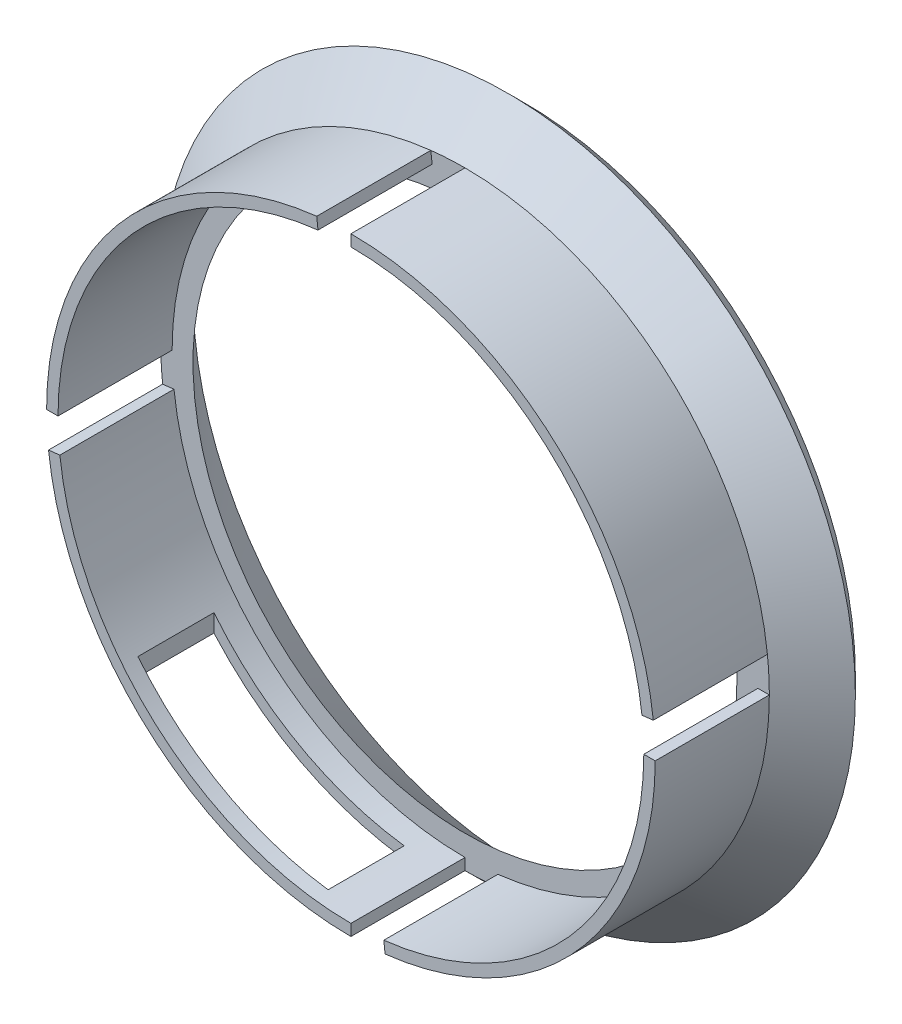
ISO-10303-21;
HEADER;
FILE_DESCRIPTION(('STEP AP214'),'2;1');
FILE_NAME('part.step','',(''),(''),'','','');
FILE_SCHEMA(('AUTOMOTIVE_DESIGN { 1 0 10303 214 1 1 1 1 }'));
ENDSEC;
DATA;
#1=APPLICATION_CONTEXT('core data for automotive mechanical design processes');
#2=APPLICATION_PROTOCOL_DEFINITION('international standard','automotive_design',2000,#1);
#3=PRODUCT_CONTEXT('',#1,'mechanical');
#4=PRODUCT('Part','Part','',(#3));
#5=PRODUCT_RELATED_PRODUCT_CATEGORY('part','',(#4));
#6=PRODUCT_DEFINITION_FORMATION('','',#4);
#7=PRODUCT_DEFINITION_CONTEXT('part definition',#1,'design');
#8=PRODUCT_DEFINITION('design','',#6,#7);
#9=PRODUCT_DEFINITION_SHAPE('','',#8);
#10=(LENGTH_UNIT() NAMED_UNIT(*) SI_UNIT(.MILLI.,.METRE.));
#11=(NAMED_UNIT(*) PLANE_ANGLE_UNIT() SI_UNIT($,.RADIAN.));
#12=(NAMED_UNIT(*) SI_UNIT($,.STERADIAN.) SOLID_ANGLE_UNIT());
#13=UNCERTAINTY_MEASURE_WITH_UNIT(LENGTH_MEASURE(1.E-05),#10,'distance_accuracy_value','');
#14=(GEOMETRIC_REPRESENTATION_CONTEXT(3) GLOBAL_UNCERTAINTY_ASSIGNED_CONTEXT((#13)) GLOBAL_UNIT_ASSIGNED_CONTEXT((#10,
#11,#12)) REPRESENTATION_CONTEXT('',''));
#15=CARTESIAN_POINT('',(0.,0.,0.));
#16=DIRECTION('',(0.,0.,1.));
#17=DIRECTION('',(1.,0.,0.));
#18=AXIS2_PLACEMENT_3D('',#15,#16,#17);
#19=CARTESIAN_POINT('',(0.,0.,15.));
#20=DIRECTION('',(0.,0.,-1.));
#21=DIRECTION('',(-1.,0.,0.));
#22=AXIS2_PLACEMENT_3D('',#19,#20,#21);
#23=CYLINDRICAL_SURFACE('',#22,38.5);
#24=CARTESIAN_POINT('',(0.,0.,0.));
#25=DIRECTION('',(0.,0.,1.));
#26=DIRECTION('',(1.,0.,0.));
#27=AXIS2_PLACEMENT_3D('',#24,#25,#26);
#28=CIRCLE('',#27,38.5);
#29=CARTESIAN_POINT('',(-4.32439239838076,38.2563671875,0.));
#30=VERTEX_POINT('',#29);
#31=CARTESIAN_POINT('',(-38.5,0.,0.));
#32=VERTEX_POINT('',#31);
#33=EDGE_CURVE('E331',#30,#32,#28,.T.);
#34=ORIENTED_EDGE('',*,*,#33,.F.);
#35=DIRECTION('',(0.,0.,-1.));
#36=VECTOR('',#35,1.);
#37=CARTESIAN_POINT('',(-4.32439239838076,38.2563671875,15.));
#38=LINE('',#37,#36);
#39=CARTESIAN_POINT('',(-4.32439239838076,38.2563671875,15.));
#40=VERTEX_POINT('',#39);
#41=EDGE_CURVE('E11',#40,#30,#38,.T.);
#42=ORIENTED_EDGE('',*,*,#41,.F.);
#43=CARTESIAN_POINT('',(0.,0.,15.));
#44=DIRECTION('',(0.,0.,1.));
#45=DIRECTION('',(1.,0.,0.));
#46=AXIS2_PLACEMENT_3D('',#43,#44,#45);
#47=CIRCLE('',#46,38.5);
#48=CARTESIAN_POINT('',(-38.5,0.,15.));
#49=VERTEX_POINT('',#48);
#50=EDGE_CURVE('E334',#40,#49,#47,.T.);
#51=ORIENTED_EDGE('',*,*,#50,.T.);
#52=DIRECTION('',(0.,0.,-1.));
#53=VECTOR('',#52,1.);
#54=CARTESIAN_POINT('',(-38.5,0.,15.));
#55=LINE('',#54,#53);
#56=EDGE_CURVE('E346',#49,#32,#55,.T.);
#57=ORIENTED_EDGE('',*,*,#56,.T.);
#58=EDGE_LOOP('',(#34,#42,#51,#57));
#59=FACE_BOUND('',#58,.T.);
#60=ADVANCED_FACE('F47',(#59),#23,.F.);
#61=CARTESIAN_POINT('',(0.,0.,15.));
#62=DIRECTION('',(0.993671875,0.112321880477423,0.));
#63=DIRECTION('',(-0.112321880477423,0.993671875,0.));
#64=AXIS2_PLACEMENT_3D('',#61,#62,#63);
#65=PLANE('',#64);
#66=DIRECTION('',(0.112321880477423,-0.993671875,0.));
#67=VECTOR('',#66,1.);
#68=CARTESIAN_POINT('',(0.,0.,0.));
#69=LINE('',#68,#67);
#70=CARTESIAN_POINT('',(-4.4928752190969,39.746875,0.));
#71=VERTEX_POINT('',#70);
#72=EDGE_CURVE('E349',#71,#30,#69,.T.);
#73=ORIENTED_EDGE('',*,*,#72,.F.);
#74=DIRECTION('',(0.,0.,-1.));
#75=VECTOR('',#74,1.);
#76=CARTESIAN_POINT('',(-4.4928752190969,39.746875,15.));
#77=LINE('',#76,#75);
#78=CARTESIAN_POINT('',(-4.4928752190969,39.746875,15.));
#79=VERTEX_POINT('',#78);
#80=EDGE_CURVE('E54',#79,#71,#77,.T.);
#81=ORIENTED_EDGE('',*,*,#80,.F.);
#82=DIRECTION('',(0.112321880477423,-0.993671875,0.));
#83=VECTOR('',#82,1.);
#84=CARTESIAN_POINT('',(0.,0.,15.));
#85=LINE('',#84,#83);
#86=EDGE_CURVE('E337',#79,#40,#85,.T.);
#87=ORIENTED_EDGE('',*,*,#86,.T.);
#88=ORIENTED_EDGE('',*,*,#41,.T.);
#89=EDGE_LOOP('',(#73,#81,#87,#88));
#90=FACE_BOUND('',#89,.T.);
#91=ADVANCED_FACE('F368',(#90),#65,.T.);
#92=CARTESIAN_POINT('',(0.,0.,15.));
#93=DIRECTION('',(0.,0.,-1.));
#94=DIRECTION('',(-1.,0.,0.));
#95=AXIS2_PLACEMENT_3D('',#92,#93,#94);
#96=CYLINDRICAL_SURFACE('',#95,40.);
#97=CARTESIAN_POINT('',(0.,0.,0.));
#98=DIRECTION('',(0.,0.,1.));
#99=DIRECTION('',(1.,0.,0.));
#100=AXIS2_PLACEMENT_3D('',#97,#98,#99);
#101=CIRCLE('',#100,40.);
#102=CARTESIAN_POINT('',(-40.,0.,0.));
#103=VERTEX_POINT('',#102);
#104=EDGE_CURVE('E352',#71,#103,#101,.T.);
#105=ORIENTED_EDGE('',*,*,#104,.T.);
#106=DIRECTION('',(0.,0.,-1.));
#107=VECTOR('',#106,1.);
#108=CARTESIAN_POINT('',(-40.,0.,15.));
#109=LINE('',#108,#107);
#110=CARTESIAN_POINT('',(-40.,0.,15.));
#111=VERTEX_POINT('',#110);
#112=EDGE_CURVE('E358',#111,#103,#109,.T.);
#113=ORIENTED_EDGE('',*,*,#112,.F.);
#114=CARTESIAN_POINT('',(0.,0.,15.));
#115=DIRECTION('',(0.,0.,1.));
#116=DIRECTION('',(1.,0.,0.));
#117=AXIS2_PLACEMENT_3D('',#114,#115,#116);
#118=CIRCLE('',#117,40.);
#119=EDGE_CURVE('E341',#79,#111,#118,.T.);
#120=ORIENTED_EDGE('',*,*,#119,.F.);
#121=ORIENTED_EDGE('',*,*,#80,.T.);
#122=EDGE_LOOP('',(#105,#113,#120,#121));
#123=FACE_BOUND('',#122,.T.);
#124=ADVANCED_FACE('F363',(#123),#96,.T.);
#125=CARTESIAN_POINT('',(0.,0.,15.));
#126=DIRECTION('',(0.,-1.,0.));
#127=DIRECTION('',(0.,0.,-1.));
#128=AXIS2_PLACEMENT_3D('',#125,#126,#127);
#129=PLANE('',#128);
#130=DIRECTION('',(-1.,0.,0.));
#131=VECTOR('',#130,1.);
#132=CARTESIAN_POINT('',(0.,0.,0.));
#133=LINE('',#132,#131);
#134=EDGE_CURVE('E338',#32,#103,#133,.T.);
#135=ORIENTED_EDGE('',*,*,#134,.F.);
#136=ORIENTED_EDGE('',*,*,#56,.F.);
#137=DIRECTION('',(-1.,0.,0.));
#138=VECTOR('',#137,1.);
#139=CARTESIAN_POINT('',(0.,0.,15.));
#140=LINE('',#139,#138);
#141=EDGE_CURVE('E343',#49,#111,#140,.T.);
#142=ORIENTED_EDGE('',*,*,#141,.T.);
#143=ORIENTED_EDGE('',*,*,#112,.T.);
#144=EDGE_LOOP('',(#135,#136,#142,#143));
#145=FACE_BOUND('',#144,.T.);
#146=ADVANCED_FACE('F416',(#145),#129,.T.);
#147=CARTESIAN_POINT('',(0.,0.,15.));
#148=DIRECTION('',(0.,0.,1.));
#149=DIRECTION('',(1.,0.,0.));
#150=AXIS2_PLACEMENT_3D('',#147,#148,#149);
#151=PLANE('',#150);
#152=ORIENTED_EDGE('',*,*,#50,.F.);
#153=ORIENTED_EDGE('',*,*,#86,.F.);
#154=ORIENTED_EDGE('',*,*,#119,.T.);
#155=ORIENTED_EDGE('',*,*,#141,.F.);
#156=EDGE_LOOP('',(#152,#153,#154,#155));
#157=FACE_BOUND('',#156,.T.);
#158=ADVANCED_FACE('F418',(#157),#151,.T.);
#159=CARTESIAN_POINT('',(-35.7573593128807,0.,0.));
#160=DIRECTION('',(0.,0.,-1.));
#161=DIRECTION('',(-1.,0.,0.));
#162=AXIS2_PLACEMENT_3D('',#159,#160,#161);
#163=PLANE('',#162);
#164=CARTESIAN_POINT('',(0.,0.,0.));
#165=DIRECTION('',(0.,0.,1.));
#166=DIRECTION('',(1.,0.,0.));
#167=AXIS2_PLACEMENT_3D('',#164,#165,#166);
#168=CIRCLE('',#167,35.7573593128807);
#169=CARTESIAN_POINT('',(35.7573593128807,0.,0.));
#170=VERTEX_POINT('',#169);
#171=EDGE_CURVE('E318',#170,#170,#168,.T.);
#172=ORIENTED_EDGE('',*,*,#171,.F.);
#173=EDGE_LOOP('',(#172));
#174=FACE_BOUND('',#173,.T.);
#175=CARTESIAN_POINT('',(0.,0.,0.));
#176=DIRECTION('',(0.,0.,1.));
#177=DIRECTION('',(1.,0.,0.));
#178=AXIS2_PLACEMENT_3D('',#175,#176,#177);
#179=CIRCLE('',#178,40.);
#180=CARTESIAN_POINT('',(0.,-40.,0.));
#181=VERTEX_POINT('',#180);
#182=CARTESIAN_POINT('',(4.4928752190969,-39.746875,0.));
#183=VERTEX_POINT('',#182);
#184=EDGE_CURVE('E332',#181,#183,#179,.T.);
#185=ORIENTED_EDGE('',*,*,#184,.T.);
#186=DIRECTION('',(-0.112321880477423,0.993671875,0.));
#187=VECTOR('',#186,1.);
#188=CARTESIAN_POINT('',(0.,0.,0.));
#189=LINE('',#188,#187);
#190=CARTESIAN_POINT('',(4.32439239838076,-38.2563671875,0.));
#191=VERTEX_POINT('',#190);
#192=EDGE_CURVE('E236',#183,#191,#189,.T.);
#193=ORIENTED_EDGE('',*,*,#192,.T.);
#194=CARTESIAN_POINT('',(0.,0.,0.));
#195=DIRECTION('',(0.,0.,1.));
#196=DIRECTION('',(1.,0.,0.));
#197=AXIS2_PLACEMENT_3D('',#194,#195,#196);
#198=CIRCLE('',#197,38.5);
#199=CARTESIAN_POINT('',(38.5,0.,0.));
#200=VERTEX_POINT('',#199);
#201=EDGE_CURVE('E221',#191,#200,#198,.T.);
#202=ORIENTED_EDGE('',*,*,#201,.T.);
#203=DIRECTION('',(1.,0.,0.));
#204=VECTOR('',#203,1.);
#205=CARTESIAN_POINT('',(0.,0.,0.));
#206=LINE('',#205,#204);
#207=CARTESIAN_POINT('',(40.,0.,0.));
#208=VERTEX_POINT('',#207);
#209=EDGE_CURVE('E226',#200,#208,#206,.T.);
#210=ORIENTED_EDGE('',*,*,#209,.T.);
#211=CARTESIAN_POINT('',(39.746875,4.4928752190969,0.));
#212=VERTEX_POINT('',#211);
#213=EDGE_CURVE('E333',#208,#212,#179,.T.);
#214=ORIENTED_EDGE('',*,*,#213,.T.);
#215=DIRECTION('',(-0.993671875,-0.112321880477422,0.));
#216=VECTOR('',#215,1.);
#217=CARTESIAN_POINT('',(0.,0.,0.));
#218=LINE('',#217,#216);
#219=CARTESIAN_POINT('',(38.2563671875,4.32439239838076,0.));
#220=VERTEX_POINT('',#219);
#221=EDGE_CURVE('E268',#212,#220,#218,.T.);
#222=ORIENTED_EDGE('',*,*,#221,.T.);
#223=CARTESIAN_POINT('',(0.,0.,0.));
#224=DIRECTION('',(0.,0.,1.));
#225=DIRECTION('',(1.,0.,0.));
#226=AXIS2_PLACEMENT_3D('',#223,#224,#225);
#227=CIRCLE('',#226,38.5);
#228=CARTESIAN_POINT('',(0.,38.5,0.));
#229=VERTEX_POINT('',#228);
#230=EDGE_CURVE('E254',#220,#229,#227,.T.);
#231=ORIENTED_EDGE('',*,*,#230,.T.);
#232=DIRECTION('',(0.,-1.,0.));
#233=VECTOR('',#232,1.);
#234=CARTESIAN_POINT('',(0.,0.,0.));
#235=LINE('',#234,#233);
#236=CARTESIAN_POINT('',(0.,40.,0.));
#237=VERTEX_POINT('',#236);
#238=EDGE_CURVE('E259',#237,#229,#235,.T.);
#239=ORIENTED_EDGE('',*,*,#238,.F.);
#240=EDGE_CURVE('E327',#237,#71,#179,.T.);
#241=ORIENTED_EDGE('',*,*,#240,.T.);
#242=ORIENTED_EDGE('',*,*,#72,.T.);
#243=ORIENTED_EDGE('',*,*,#33,.T.);
#244=ORIENTED_EDGE('',*,*,#134,.T.);
#245=CARTESIAN_POINT('',(-39.746875,-4.4928752190969,0.));
#246=VERTEX_POINT('',#245);
#247=EDGE_CURVE('E328',#103,#246,#179,.T.);
#248=ORIENTED_EDGE('',*,*,#247,.T.);
#249=DIRECTION('',(0.993671875,0.112321880477422,0.));
#250=VECTOR('',#249,1.);
#251=CARTESIAN_POINT('',(0.,0.,0.));
#252=LINE('',#251,#250);
#253=CARTESIAN_POINT('',(-38.2563671875,-4.32439239838076,0.));
#254=VERTEX_POINT('',#253);
#255=EDGE_CURVE('E300',#246,#254,#252,.T.);
#256=ORIENTED_EDGE('',*,*,#255,.T.);
#257=CARTESIAN_POINT('',(0.,0.,0.));
#258=DIRECTION('',(0.,0.,1.));
#259=DIRECTION('',(1.,0.,0.));
#260=AXIS2_PLACEMENT_3D('',#257,#258,#259);
#261=CIRCLE('',#260,38.5);
#262=CARTESIAN_POINT('',(0.,-38.5,0.));
#263=VERTEX_POINT('',#262);
#264=EDGE_CURVE('E286',#254,#263,#261,.T.);
#265=ORIENTED_EDGE('',*,*,#264,.T.);
#266=DIRECTION('',(0.,1.,0.));
#267=VECTOR('',#266,1.);
#268=CARTESIAN_POINT('',(0.,0.,0.));
#269=LINE('',#268,#267);
#270=EDGE_CURVE('E291',#181,#263,#269,.T.);
#271=ORIENTED_EDGE('',*,*,#270,.F.);
#272=EDGE_LOOP('',(#185,#193,#202,#210,#214,#222,#231,#239,#241,#242,#243,#244,#248,#256,#265,#271));
#273=FACE_BOUND('',#272,.T.);
#274=ADVANCED_FACE('F377',(#174,#273),#163,.F.);
#275=CARTESIAN_POINT('',(0.,0.,-5.65685424949239));
#276=DIRECTION('',(0.,0.,-1.));
#277=DIRECTION('',(-1.,0.,0.));
#278=AXIS2_PLACEMENT_3D('',#275,#276,#277);
#279=CONICAL_SURFACE('',#278,45.6568542494924,0.785398163397446);
#280=ORIENTED_EDGE('',*,*,#104,.F.);
#281=ORIENTED_EDGE('',*,*,#240,.F.);
#282=CARTESIAN_POINT('',(0.,0.,0.));
#283=DIRECTION('',(0.,0.,1.));
#284=DIRECTION('',(1.,0.,0.));
#285=AXIS2_PLACEMENT_3D('',#282,#283,#284);
#286=CIRCLE('',#285,40.);
#287=EDGE_CURVE('E270',#212,#237,#286,.T.);
#288=ORIENTED_EDGE('',*,*,#287,.F.);
#289=ORIENTED_EDGE('',*,*,#213,.F.);
#290=CARTESIAN_POINT('',(0.,0.,0.));
#291=DIRECTION('',(0.,0.,1.));
#292=DIRECTION('',(1.,0.,0.));
#293=AXIS2_PLACEMENT_3D('',#290,#291,#292);
#294=CIRCLE('',#293,40.);
#295=EDGE_CURVE('E238',#183,#208,#294,.T.);
#296=ORIENTED_EDGE('',*,*,#295,.F.);
#297=ORIENTED_EDGE('',*,*,#184,.F.);
#298=CARTESIAN_POINT('',(0.,0.,0.));
#299=DIRECTION('',(0.,0.,1.));
#300=DIRECTION('',(1.,0.,0.));
#301=AXIS2_PLACEMENT_3D('',#298,#299,#300);
#302=CIRCLE('',#301,40.);
#303=EDGE_CURVE('E302',#246,#181,#302,.T.);
#304=ORIENTED_EDGE('',*,*,#303,.F.);
#305=ORIENTED_EDGE('',*,*,#247,.F.);
#306=EDGE_LOOP('',(#280,#281,#288,#289,#296,#297,#304,#305));
#307=FACE_BOUND('',#306,.T.);
#308=CARTESIAN_POINT('',(0.,0.,-5.65685424949239));
#309=DIRECTION('',(0.,0.,1.));
#310=DIRECTION('',(1.,0.,0.));
#311=AXIS2_PLACEMENT_3D('',#308,#309,#310);
#312=CIRCLE('',#311,45.6568542494924);
#313=CARTESIAN_POINT('',(45.6568542494924,0.,-5.65685424949239));
#314=VERTEX_POINT('',#313);
#315=EDGE_CURVE('E324',#314,#314,#312,.T.);
#316=ORIENTED_EDGE('',*,*,#315,.T.);
#317=EDGE_LOOP('',(#316));
#318=FACE_BOUND('',#317,.T.);
#319=ADVANCED_FACE('F372',(#307,#318),#279,.T.);
#320=CARTESIAN_POINT('',(0.,0.,-7.77817459305203));
#321=DIRECTION('',(0.,0.,1.));
#322=DIRECTION('',(1.,0.,0.));
#323=AXIS2_PLACEMENT_3D('',#320,#321,#322);
#324=CONICAL_SURFACE('',#323,43.5355339059327,0.785398163397447);
#325=ORIENTED_EDGE('',*,*,#315,.F.);
#326=EDGE_LOOP('',(#325));
#327=FACE_BOUND('',#326,.T.);
#328=CARTESIAN_POINT('',(0.,0.,-7.77817459305203));
#329=DIRECTION('',(0.,0.,1.));
#330=DIRECTION('',(1.,0.,0.));
#331=AXIS2_PLACEMENT_3D('',#328,#329,#330);
#332=CIRCLE('',#331,43.5355339059327);
#333=CARTESIAN_POINT('',(43.5355339059327,0.,-7.77817459305203));
#334=VERTEX_POINT('',#333);
#335=EDGE_CURVE('E321',#334,#334,#332,.T.);
#336=ORIENTED_EDGE('',*,*,#335,.T.);
#337=EDGE_LOOP('',(#336));
#338=FACE_BOUND('',#337,.T.);
#339=ADVANCED_FACE('F452',(#327,#338),#324,.T.);
#340=CARTESIAN_POINT('',(0.,0.,0.));
#341=DIRECTION('',(0.,0.,-1.));
#342=DIRECTION('',(-1.,0.,0.));
#343=AXIS2_PLACEMENT_3D('',#340,#341,#342);
#344=CONICAL_SURFACE('',#343,35.7573593128807,0.785398163397447);
#345=ORIENTED_EDGE('',*,*,#335,.F.);
#346=EDGE_LOOP('',(#345));
#347=FACE_BOUND('',#346,.T.);
#348=ORIENTED_EDGE('',*,*,#171,.T.);
#349=EDGE_LOOP('',(#348));
#350=FACE_BOUND('',#349,.T.);
#351=ADVANCED_FACE('F459',(#347,#350),#344,.F.);
#352=CARTESIAN_POINT('',(0.,0.,15.));
#353=DIRECTION('',(0.,0.,-1.));
#354=DIRECTION('',(-1.,0.,0.));
#355=AXIS2_PLACEMENT_3D('',#352,#353,#354);
#356=CYLINDRICAL_SURFACE('',#355,38.5);
#357=DIRECTION('',(0.,0.,-1.));
#358=VECTOR('',#357,1.);
#359=CARTESIAN_POINT('',(-30.,-24.1298570240273,15.));
#360=LINE('',#359,#358);
#361=CARTESIAN_POINT('',(-30.,-24.1298570240273,13.));
#362=VERTEX_POINT('',#361);
#363=CARTESIAN_POINT('',(-30.,-24.1298570240273,3.));
#364=VERTEX_POINT('',#363);
#365=EDGE_CURVE('E189',#362,#364,#360,.T.);
#366=ORIENTED_EDGE('',*,*,#365,.T.);
#367=CARTESIAN_POINT('',(0.,0.,3.));
#368=DIRECTION('',(0.,0.,-1.));
#369=DIRECTION('',(-1.,0.,0.));
#370=AXIS2_PLACEMENT_3D('',#367,#368,#369);
#371=CIRCLE('',#370,38.5);
#372=CARTESIAN_POINT('',(-5.,-38.1739439932528,3.));
#373=VERTEX_POINT('',#372);
#374=EDGE_CURVE('E207',#364,#373,#371,.F.);
#375=ORIENTED_EDGE('',*,*,#374,.T.);
#376=DIRECTION('',(0.,0.,-1.));
#377=VECTOR('',#376,1.);
#378=CARTESIAN_POINT('',(-5.,-38.1739439932528,15.));
#379=LINE('',#378,#377);
#380=CARTESIAN_POINT('',(-5.,-38.1739439932528,13.));
#381=VERTEX_POINT('',#380);
#382=EDGE_CURVE('E204',#373,#381,#379,.F.);
#383=ORIENTED_EDGE('',*,*,#382,.T.);
#384=CARTESIAN_POINT('',(0.,0.,13.));
#385=DIRECTION('',(0.,0.,1.));
#386=DIRECTION('',(1.,0.,0.));
#387=AXIS2_PLACEMENT_3D('',#384,#385,#386);
#388=CIRCLE('',#387,38.5);
#389=EDGE_CURVE('E197',#381,#362,#388,.F.);
#390=ORIENTED_EDGE('',*,*,#389,.T.);
#391=EDGE_LOOP('',(#366,#375,#383,#390));
#392=FACE_BOUND('',#391,.T.);
#393=ORIENTED_EDGE('',*,*,#264,.F.);
#394=DIRECTION('',(0.,0.,-1.));
#395=VECTOR('',#394,1.);
#396=CARTESIAN_POINT('',(-38.2563671875,-4.32439239838076,15.));
#397=LINE('',#396,#395);
#398=CARTESIAN_POINT('',(-38.2563671875,-4.32439239838076,15.));
#399=VERTEX_POINT('',#398);
#400=EDGE_CURVE('E315',#399,#254,#397,.T.);
#401=ORIENTED_EDGE('',*,*,#400,.F.);
#402=CARTESIAN_POINT('',(0.,0.,15.));
#403=DIRECTION('',(0.,0.,1.));
#404=DIRECTION('',(1.,0.,0.));
#405=AXIS2_PLACEMENT_3D('',#402,#403,#404);
#406=CIRCLE('',#405,38.5);
#407=CARTESIAN_POINT('',(0.,-38.5,15.));
#408=VERTEX_POINT('',#407);
#409=EDGE_CURVE('E287',#399,#408,#406,.T.);
#410=ORIENTED_EDGE('',*,*,#409,.T.);
#411=DIRECTION('',(0.,0.,-1.));
#412=VECTOR('',#411,1.);
#413=CARTESIAN_POINT('',(0.,-38.5,15.));
#414=LINE('',#413,#412);
#415=EDGE_CURVE('E298',#408,#263,#414,.T.);
#416=ORIENTED_EDGE('',*,*,#415,.T.);
#417=EDGE_LOOP('',(#393,#401,#410,#416));
#418=FACE_BOUND('',#417,.T.);
#419=ADVANCED_FACE('F388',(#392,#418),#356,.F.);
#420=CARTESIAN_POINT('',(0.,0.,15.));
#421=DIRECTION('',(-0.112321880477422,0.993671875,0.));
#422=DIRECTION('',(-0.993671875,-0.112321880477422,0.));
#423=AXIS2_PLACEMENT_3D('',#420,#421,#422);
#424=PLANE('',#423);
#425=ORIENTED_EDGE('',*,*,#255,.F.);
#426=DIRECTION('',(0.,0.,-1.));
#427=VECTOR('',#426,1.);
#428=CARTESIAN_POINT('',(-39.746875,-4.4928752190969,15.));
#429=LINE('',#428,#427);
#430=CARTESIAN_POINT('',(-39.746875,-4.4928752190969,15.));
#431=VERTEX_POINT('',#430);
#432=EDGE_CURVE('E312',#431,#246,#429,.T.);
#433=ORIENTED_EDGE('',*,*,#432,.F.);
#434=DIRECTION('',(0.993671875,0.112321880477422,0.));
#435=VECTOR('',#434,1.);
#436=CARTESIAN_POINT('',(0.,0.,15.));
#437=LINE('',#436,#435);
#438=EDGE_CURVE('E290',#431,#399,#437,.T.);
#439=ORIENTED_EDGE('',*,*,#438,.T.);
#440=ORIENTED_EDGE('',*,*,#400,.T.);
#441=EDGE_LOOP('',(#425,#433,#439,#440));
#442=FACE_BOUND('',#441,.T.);
#443=ADVANCED_FACE('F384',(#442),#424,.T.);
#444=CARTESIAN_POINT('',(0.,0.,15.));
#445=DIRECTION('',(0.,0.,-1.));
#446=DIRECTION('',(-1.,0.,0.));
#447=AXIS2_PLACEMENT_3D('',#444,#445,#446);
#448=CYLINDRICAL_SURFACE('',#447,40.);
#449=CARTESIAN_POINT('',(0.,0.,3.));
#450=DIRECTION('',(0.,0.,-1.));
#451=DIRECTION('',(-1.,0.,0.));
#452=AXIS2_PLACEMENT_3D('',#449,#450,#451);
#453=CIRCLE('',#452,40.);
#454=CARTESIAN_POINT('',(-30.,-26.4575131106459,3.));
#455=VERTEX_POINT('',#454);
#456=CARTESIAN_POINT('',(-5.,-39.6862696659689,3.));
#457=VERTEX_POINT('',#456);
#458=EDGE_CURVE('E203',#455,#457,#453,.F.);
#459=ORIENTED_EDGE('',*,*,#458,.F.);
#460=DIRECTION('',(0.,0.,-1.));
#461=VECTOR('',#460,1.);
#462=CARTESIAN_POINT('',(-30.,-26.4575131106459,15.));
#463=LINE('',#462,#461);
#464=CARTESIAN_POINT('',(-30.,-26.4575131106459,13.));
#465=VERTEX_POINT('',#464);
#466=EDGE_CURVE('E186',#465,#455,#463,.T.);
#467=ORIENTED_EDGE('',*,*,#466,.F.);
#468=CARTESIAN_POINT('',(0.,0.,13.));
#469=DIRECTION('',(0.,0.,1.));
#470=DIRECTION('',(1.,0.,0.));
#471=AXIS2_PLACEMENT_3D('',#468,#469,#470);
#472=CIRCLE('',#471,40.);
#473=CARTESIAN_POINT('',(-5.,-39.6862696659689,13.));
#474=VERTEX_POINT('',#473);
#475=EDGE_CURVE('E194',#474,#465,#472,.F.);
#476=ORIENTED_EDGE('',*,*,#475,.F.);
#477=DIRECTION('',(0.,0.,-1.));
#478=VECTOR('',#477,1.);
#479=CARTESIAN_POINT('',(-5.,-39.6862696659689,15.));
#480=LINE('',#479,#478);
#481=EDGE_CURVE('E69',#457,#474,#480,.F.);
#482=ORIENTED_EDGE('',*,*,#481,.F.);
#483=EDGE_LOOP('',(#459,#467,#476,#482));
#484=FACE_BOUND('',#483,.T.);
#485=ORIENTED_EDGE('',*,*,#303,.T.);
#486=DIRECTION('',(0.,0.,-1.));
#487=VECTOR('',#486,1.);
#488=CARTESIAN_POINT('',(0.,-40.,15.));
#489=LINE('',#488,#487);
#490=CARTESIAN_POINT('',(0.,-40.,15.));
#491=VERTEX_POINT('',#490);
#492=EDGE_CURVE('E309',#491,#181,#489,.T.);
#493=ORIENTED_EDGE('',*,*,#492,.F.);
#494=CARTESIAN_POINT('',(0.,0.,15.));
#495=DIRECTION('',(0.,0.,1.));
#496=DIRECTION('',(1.,0.,0.));
#497=AXIS2_PLACEMENT_3D('',#494,#495,#496);
#498=CIRCLE('',#497,40.);
#499=EDGE_CURVE('E294',#431,#491,#498,.T.);
#500=ORIENTED_EDGE('',*,*,#499,.F.);
#501=ORIENTED_EDGE('',*,*,#432,.T.);
#502=EDGE_LOOP('',(#485,#493,#500,#501));
#503=FACE_BOUND('',#502,.T.);
#504=ADVANCED_FACE('F200',(#484,#503),#448,.T.);
#505=CARTESIAN_POINT('',(0.,0.,15.));
#506=DIRECTION('',(-1.,0.,0.));
#507=DIRECTION('',(0.,0.,1.));
#508=AXIS2_PLACEMENT_3D('',#505,#506,#507);
#509=PLANE('',#508);
#510=ORIENTED_EDGE('',*,*,#270,.T.);
#511=ORIENTED_EDGE('',*,*,#415,.F.);
#512=DIRECTION('',(0.,1.,0.));
#513=VECTOR('',#512,1.);
#514=CARTESIAN_POINT('',(0.,0.,15.));
#515=LINE('',#514,#513);
#516=EDGE_CURVE('E296',#491,#408,#515,.T.);
#517=ORIENTED_EDGE('',*,*,#516,.F.);
#518=ORIENTED_EDGE('',*,*,#492,.T.);
#519=EDGE_LOOP('',(#510,#511,#517,#518));
#520=FACE_BOUND('',#519,.T.);
#521=ADVANCED_FACE('F392',(#520),#509,.F.);
#522=CARTESIAN_POINT('',(0.,0.,15.));
#523=DIRECTION('',(0.,0.,1.));
#524=DIRECTION('',(1.,0.,0.));
#525=AXIS2_PLACEMENT_3D('',#522,#523,#524);
#526=PLANE('',#525);
#527=ORIENTED_EDGE('',*,*,#409,.F.);
#528=ORIENTED_EDGE('',*,*,#438,.F.);
#529=ORIENTED_EDGE('',*,*,#499,.T.);
#530=ORIENTED_EDGE('',*,*,#516,.T.);
#531=EDGE_LOOP('',(#527,#528,#529,#530));
#532=FACE_BOUND('',#531,.T.);
#533=ADVANCED_FACE('F395',(#532),#526,.T.);
#534=CARTESIAN_POINT('',(0.,0.,15.));
#535=DIRECTION('',(0.,0.,-1.));
#536=DIRECTION('',(-1.,0.,0.));
#537=AXIS2_PLACEMENT_3D('',#534,#535,#536);
#538=CYLINDRICAL_SURFACE('',#537,38.5);
#539=ORIENTED_EDGE('',*,*,#230,.F.);
#540=DIRECTION('',(0.,0.,-1.));
#541=VECTOR('',#540,1.);
#542=CARTESIAN_POINT('',(38.2563671875,4.32439239838076,15.));
#543=LINE('',#542,#541);
#544=CARTESIAN_POINT('',(38.2563671875,4.32439239838076,15.));
#545=VERTEX_POINT('',#544);
#546=EDGE_CURVE('E283',#545,#220,#543,.T.);
#547=ORIENTED_EDGE('',*,*,#546,.F.);
#548=CARTESIAN_POINT('',(0.,0.,15.));
#549=DIRECTION('',(0.,0.,1.));
#550=DIRECTION('',(1.,0.,0.));
#551=AXIS2_PLACEMENT_3D('',#548,#549,#550);
#552=CIRCLE('',#551,38.5);
#553=CARTESIAN_POINT('',(0.,38.5,15.));
#554=VERTEX_POINT('',#553);
#555=EDGE_CURVE('E255',#545,#554,#552,.T.);
#556=ORIENTED_EDGE('',*,*,#555,.T.);
#557=DIRECTION('',(0.,0.,-1.));
#558=VECTOR('',#557,1.);
#559=CARTESIAN_POINT('',(0.,38.5,15.));
#560=LINE('',#559,#558);
#561=EDGE_CURVE('E266',#554,#229,#560,.T.);
#562=ORIENTED_EDGE('',*,*,#561,.T.);
#563=EDGE_LOOP('',(#539,#547,#556,#562));
#564=FACE_BOUND('',#563,.T.);
#565=ADVANCED_FACE('F397',(#564),#538,.F.);
#566=CARTESIAN_POINT('',(0.,0.,15.));
#567=DIRECTION('',(0.112321880477422,-0.993671875,0.));
#568=DIRECTION('',(0.993671875,0.112321880477422,0.));
#569=AXIS2_PLACEMENT_3D('',#566,#567,#568);
#570=PLANE('',#569);
#571=ORIENTED_EDGE('',*,*,#221,.F.);
#572=DIRECTION('',(0.,0.,-1.));
#573=VECTOR('',#572,1.);
#574=CARTESIAN_POINT('',(39.746875,4.4928752190969,15.));
#575=LINE('',#574,#573);
#576=CARTESIAN_POINT('',(39.746875,4.4928752190969,15.));
#577=VERTEX_POINT('',#576);
#578=EDGE_CURVE('E280',#577,#212,#575,.T.);
#579=ORIENTED_EDGE('',*,*,#578,.F.);
#580=DIRECTION('',(-0.993671875,-0.112321880477422,0.));
#581=VECTOR('',#580,1.);
#582=CARTESIAN_POINT('',(0.,0.,15.));
#583=LINE('',#582,#581);
#584=EDGE_CURVE('E258',#577,#545,#583,.T.);
#585=ORIENTED_EDGE('',*,*,#584,.T.);
#586=ORIENTED_EDGE('',*,*,#546,.T.);
#587=EDGE_LOOP('',(#571,#579,#585,#586));
#588=FACE_BOUND('',#587,.T.);
#589=ADVANCED_FACE('F403',(#588),#570,.T.);
#590=CARTESIAN_POINT('',(0.,0.,15.));
#591=DIRECTION('',(0.,0.,-1.));
#592=DIRECTION('',(-1.,0.,0.));
#593=AXIS2_PLACEMENT_3D('',#590,#591,#592);
#594=CYLINDRICAL_SURFACE('',#593,40.);
#595=ORIENTED_EDGE('',*,*,#287,.T.);
#596=DIRECTION('',(0.,0.,-1.));
#597=VECTOR('',#596,1.);
#598=CARTESIAN_POINT('',(0.,40.,15.));
#599=LINE('',#598,#597);
#600=CARTESIAN_POINT('',(0.,40.,15.));
#601=VERTEX_POINT('',#600);
#602=EDGE_CURVE('E277',#601,#237,#599,.T.);
#603=ORIENTED_EDGE('',*,*,#602,.F.);
#604=CARTESIAN_POINT('',(0.,0.,15.));
#605=DIRECTION('',(0.,0.,1.));
#606=DIRECTION('',(1.,0.,0.));
#607=AXIS2_PLACEMENT_3D('',#604,#605,#606);
#608=CIRCLE('',#607,40.);
#609=EDGE_CURVE('E262',#577,#601,#608,.T.);
#610=ORIENTED_EDGE('',*,*,#609,.F.);
#611=ORIENTED_EDGE('',*,*,#578,.T.);
#612=EDGE_LOOP('',(#595,#603,#610,#611));
#613=FACE_BOUND('',#612,.T.);
#614=ADVANCED_FACE('F505',(#613),#594,.T.);
#615=CARTESIAN_POINT('',(0.,0.,15.));
#616=DIRECTION('',(1.,0.,0.));
#617=DIRECTION('',(0.,0.,-1.));
#618=AXIS2_PLACEMENT_3D('',#615,#616,#617);
#619=PLANE('',#618);
#620=ORIENTED_EDGE('',*,*,#238,.T.);
#621=ORIENTED_EDGE('',*,*,#561,.F.);
#622=DIRECTION('',(0.,-1.,0.));
#623=VECTOR('',#622,1.);
#624=CARTESIAN_POINT('',(0.,0.,15.));
#625=LINE('',#624,#623);
#626=EDGE_CURVE('E264',#601,#554,#625,.T.);
#627=ORIENTED_EDGE('',*,*,#626,.F.);
#628=ORIENTED_EDGE('',*,*,#602,.T.);
#629=EDGE_LOOP('',(#620,#621,#627,#628));
#630=FACE_BOUND('',#629,.T.);
#631=ADVANCED_FACE('F515',(#630),#619,.F.);
#632=CARTESIAN_POINT('',(0.,0.,15.));
#633=DIRECTION('',(0.,0.,1.));
#634=DIRECTION('',(1.,0.,0.));
#635=AXIS2_PLACEMENT_3D('',#632,#633,#634);
#636=PLANE('',#635);
#637=ORIENTED_EDGE('',*,*,#555,.F.);
#638=ORIENTED_EDGE('',*,*,#584,.F.);
#639=ORIENTED_EDGE('',*,*,#609,.T.);
#640=ORIENTED_EDGE('',*,*,#626,.T.);
#641=EDGE_LOOP('',(#637,#638,#639,#640));
#642=FACE_BOUND('',#641,.T.);
#643=ADVANCED_FACE('F525',(#642),#636,.T.);
#644=CARTESIAN_POINT('',(0.,0.,15.));
#645=DIRECTION('',(0.,0.,-1.));
#646=DIRECTION('',(-1.,0.,0.));
#647=AXIS2_PLACEMENT_3D('',#644,#645,#646);
#648=CYLINDRICAL_SURFACE('',#647,38.5);
#649=ORIENTED_EDGE('',*,*,#201,.F.);
#650=DIRECTION('',(0.,0.,-1.));
#651=VECTOR('',#650,1.);
#652=CARTESIAN_POINT('',(4.32439239838076,-38.2563671875,15.));
#653=LINE('',#652,#651);
#654=CARTESIAN_POINT('',(4.32439239838076,-38.2563671875,15.));
#655=VERTEX_POINT('',#654);
#656=EDGE_CURVE('E251',#655,#191,#653,.T.);
#657=ORIENTED_EDGE('',*,*,#656,.F.);
#658=CARTESIAN_POINT('',(0.,0.,15.));
#659=DIRECTION('',(0.,0.,1.));
#660=DIRECTION('',(1.,0.,0.));
#661=AXIS2_PLACEMENT_3D('',#658,#659,#660);
#662=CIRCLE('',#661,38.5);
#663=CARTESIAN_POINT('',(38.5,0.,15.));
#664=VERTEX_POINT('',#663);
#665=EDGE_CURVE('E222',#655,#664,#662,.T.);
#666=ORIENTED_EDGE('',*,*,#665,.T.);
#667=DIRECTION('',(0.,0.,-1.));
#668=VECTOR('',#667,1.);
#669=CARTESIAN_POINT('',(38.5,0.,15.));
#670=LINE('',#669,#668);
#671=EDGE_CURVE('E234',#664,#200,#670,.T.);
#672=ORIENTED_EDGE('',*,*,#671,.T.);
#673=EDGE_LOOP('',(#649,#657,#666,#672));
#674=FACE_BOUND('',#673,.T.);
#675=ADVANCED_FACE('F535',(#674),#648,.F.);
#676=CARTESIAN_POINT('',(0.,0.,15.));
#677=DIRECTION('',(-0.993671875,-0.112321880477423,0.));
#678=DIRECTION('',(0.112321880477423,-0.993671875,0.));
#679=AXIS2_PLACEMENT_3D('',#676,#677,#678);
#680=PLANE('',#679);
#681=ORIENTED_EDGE('',*,*,#192,.F.);
#682=DIRECTION('',(0.,0.,-1.));
#683=VECTOR('',#682,1.);
#684=CARTESIAN_POINT('',(4.4928752190969,-39.746875,15.));
#685=LINE('',#684,#683);
#686=CARTESIAN_POINT('',(4.4928752190969,-39.746875,15.));
#687=VERTEX_POINT('',#686);
#688=EDGE_CURVE('E248',#687,#183,#685,.T.);
#689=ORIENTED_EDGE('',*,*,#688,.F.);
#690=DIRECTION('',(-0.112321880477423,0.993671875,0.));
#691=VECTOR('',#690,1.);
#692=CARTESIAN_POINT('',(0.,0.,15.));
#693=LINE('',#692,#691);
#694=EDGE_CURVE('E225',#687,#655,#693,.T.);
#695=ORIENTED_EDGE('',*,*,#694,.T.);
#696=ORIENTED_EDGE('',*,*,#656,.T.);
#697=EDGE_LOOP('',(#681,#689,#695,#696));
#698=FACE_BOUND('',#697,.T.);
#699=ADVANCED_FACE('F545',(#698),#680,.T.);
#700=CARTESIAN_POINT('',(0.,0.,15.));
#701=DIRECTION('',(0.,0.,-1.));
#702=DIRECTION('',(-1.,0.,0.));
#703=AXIS2_PLACEMENT_3D('',#700,#701,#702);
#704=CYLINDRICAL_SURFACE('',#703,40.);
#705=ORIENTED_EDGE('',*,*,#295,.T.);
#706=DIRECTION('',(0.,0.,-1.));
#707=VECTOR('',#706,1.);
#708=CARTESIAN_POINT('',(40.,0.,15.));
#709=LINE('',#708,#707);
#710=CARTESIAN_POINT('',(40.,0.,15.));
#711=VERTEX_POINT('',#710);
#712=EDGE_CURVE('E245',#711,#208,#709,.T.);
#713=ORIENTED_EDGE('',*,*,#712,.F.);
#714=CARTESIAN_POINT('',(0.,0.,15.));
#715=DIRECTION('',(0.,0.,1.));
#716=DIRECTION('',(1.,0.,0.));
#717=AXIS2_PLACEMENT_3D('',#714,#715,#716);
#718=CIRCLE('',#717,40.);
#719=EDGE_CURVE('E229',#687,#711,#718,.T.);
#720=ORIENTED_EDGE('',*,*,#719,.F.);
#721=ORIENTED_EDGE('',*,*,#688,.T.);
#722=EDGE_LOOP('',(#705,#713,#720,#721));
#723=FACE_BOUND('',#722,.T.);
#724=ADVANCED_FACE('F555',(#723),#704,.T.);
#725=CARTESIAN_POINT('',(0.,0.,15.));
#726=DIRECTION('',(0.,1.,0.));
#727=DIRECTION('',(0.,0.,1.));
#728=AXIS2_PLACEMENT_3D('',#725,#726,#727);
#729=PLANE('',#728);
#730=ORIENTED_EDGE('',*,*,#209,.F.);
#731=ORIENTED_EDGE('',*,*,#671,.F.);
#732=DIRECTION('',(1.,0.,0.));
#733=VECTOR('',#732,1.);
#734=CARTESIAN_POINT('',(0.,0.,15.));
#735=LINE('',#734,#733);
#736=EDGE_CURVE('E231',#664,#711,#735,.T.);
#737=ORIENTED_EDGE('',*,*,#736,.T.);
#738=ORIENTED_EDGE('',*,*,#712,.T.);
#739=EDGE_LOOP('',(#730,#731,#737,#738));
#740=FACE_BOUND('',#739,.T.);
#741=ADVANCED_FACE('F565',(#740),#729,.T.);
#742=CARTESIAN_POINT('',(0.,0.,15.));
#743=DIRECTION('',(0.,0.,1.));
#744=DIRECTION('',(1.,0.,0.));
#745=AXIS2_PLACEMENT_3D('',#742,#743,#744);
#746=PLANE('',#745);
#747=ORIENTED_EDGE('',*,*,#665,.F.);
#748=ORIENTED_EDGE('',*,*,#694,.F.);
#749=ORIENTED_EDGE('',*,*,#719,.T.);
#750=ORIENTED_EDGE('',*,*,#736,.F.);
#751=EDGE_LOOP('',(#747,#748,#749,#750));
#752=FACE_BOUND('',#751,.T.);
#753=ADVANCED_FACE('F575',(#752),#746,.T.);
#754=CARTESIAN_POINT('',(-30.,-45.6578542494924,3.));
#755=DIRECTION('',(-1.,0.,0.));
#756=DIRECTION('',(0.,0.,1.));
#757=AXIS2_PLACEMENT_3D('',#754,#755,#756);
#758=PLANE('',#757);
#759=DIRECTION('',(0.,1.,0.));
#760=VECTOR('',#759,1.);
#761=CARTESIAN_POINT('',(-30.,-45.6578542494924,13.));
#762=LINE('',#761,#760);
#763=EDGE_CURVE('E61',#465,#362,#762,.T.);
#764=ORIENTED_EDGE('',*,*,#763,.F.);
#765=ORIENTED_EDGE('',*,*,#466,.T.);
#766=DIRECTION('',(0.,1.,0.));
#767=VECTOR('',#766,1.);
#768=CARTESIAN_POINT('',(-30.,-45.6578542494924,3.));
#769=LINE('',#768,#767);
#770=EDGE_CURVE('E198',#455,#364,#769,.T.);
#771=ORIENTED_EDGE('',*,*,#770,.T.);
#772=ORIENTED_EDGE('',*,*,#365,.F.);
#773=EDGE_LOOP('',(#764,#765,#771,#772));
#774=FACE_BOUND('',#773,.T.);
#775=ADVANCED_FACE('F183',(#774),#758,.F.);
#776=CARTESIAN_POINT('',(-30.,-45.6578542494924,3.));
#777=DIRECTION('',(0.,0.,-1.));
#778=DIRECTION('',(-1.,0.,0.));
#779=AXIS2_PLACEMENT_3D('',#776,#777,#778);
#780=PLANE('',#779);
#781=ORIENTED_EDGE('',*,*,#770,.F.);
#782=ORIENTED_EDGE('',*,*,#458,.T.);
#783=DIRECTION('',(0.,1.,0.));
#784=VECTOR('',#783,1.);
#785=CARTESIAN_POINT('',(-5.,-45.6578542494924,3.));
#786=LINE('',#785,#784);
#787=EDGE_CURVE('E216',#457,#373,#786,.T.);
#788=ORIENTED_EDGE('',*,*,#787,.T.);
#789=ORIENTED_EDGE('',*,*,#374,.F.);
#790=EDGE_LOOP('',(#781,#782,#788,#789));
#791=FACE_BOUND('',#790,.T.);
#792=ADVANCED_FACE('F597',(#791),#780,.F.);
#793=CARTESIAN_POINT('',(-5.,-45.6578542494924,3.));
#794=DIRECTION('',(1.,0.,0.));
#795=DIRECTION('',(0.,0.,-1.));
#796=AXIS2_PLACEMENT_3D('',#793,#794,#795);
#797=PLANE('',#796);
#798=ORIENTED_EDGE('',*,*,#787,.F.);
#799=ORIENTED_EDGE('',*,*,#481,.T.);
#800=DIRECTION('',(0.,1.,0.));
#801=VECTOR('',#800,1.);
#802=CARTESIAN_POINT('',(-5.,-45.6578542494924,13.));
#803=LINE('',#802,#801);
#804=EDGE_CURVE('E191',#474,#381,#803,.T.);
#805=ORIENTED_EDGE('',*,*,#804,.T.);
#806=ORIENTED_EDGE('',*,*,#382,.F.);
#807=EDGE_LOOP('',(#798,#799,#805,#806));
#808=FACE_BOUND('',#807,.T.);
#809=ADVANCED_FACE('F605',(#808),#797,.F.);
#810=CARTESIAN_POINT('',(-30.,-45.6578542494924,13.));
#811=DIRECTION('',(0.,0.,1.));
#812=DIRECTION('',(1.,0.,0.));
#813=AXIS2_PLACEMENT_3D('',#810,#811,#812);
#814=PLANE('',#813);
#815=ORIENTED_EDGE('',*,*,#804,.F.);
#816=ORIENTED_EDGE('',*,*,#475,.T.);
#817=ORIENTED_EDGE('',*,*,#763,.T.);
#818=ORIENTED_EDGE('',*,*,#389,.F.);
#819=EDGE_LOOP('',(#815,#816,#817,#818));
#820=FACE_BOUND('',#819,.T.);
#821=ADVANCED_FACE('F195',(#820),#814,.F.);
#822=CLOSED_SHELL('',(#60,#91,#124,#146,#158,#274,#319,#339,#351,#419,#443,#504,#521,#533,#565,
#589,#614,#631,#643,#675,#699,#724,#741,#753,#775,#792,#809,#821));
#823=MANIFOLD_SOLID_BREP('B2',#822);
#824=ADVANCED_BREP_SHAPE_REPRESENTATION('',(#18,#823),#14);
#825=SHAPE_DEFINITION_REPRESENTATION(#9,#824);
ENDSEC;
END-ISO-10303-21;
